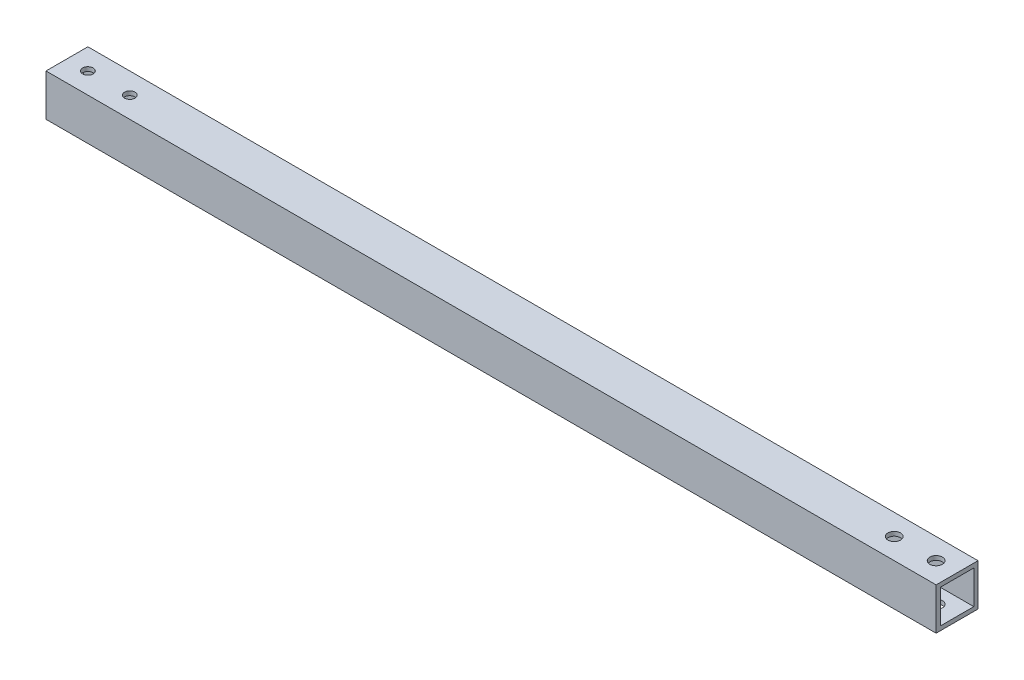
ISO-10303-21;
HEADER;
FILE_DESCRIPTION(('STEP AP214'),'2;1');
FILE_NAME('part.step','',(''),(''),'','','');
FILE_SCHEMA(('AUTOMOTIVE_DESIGN { 1 0 10303 214 1 1 1 1 }'));
ENDSEC;
DATA;
#1=APPLICATION_CONTEXT('core data for automotive mechanical design processes');
#2=APPLICATION_PROTOCOL_DEFINITION('international standard','automotive_design',2000,#1);
#3=PRODUCT_CONTEXT('',#1,'mechanical');
#4=PRODUCT('Part','Part','',(#3));
#5=PRODUCT_RELATED_PRODUCT_CATEGORY('part','',(#4));
#6=PRODUCT_DEFINITION_FORMATION('','',#4);
#7=PRODUCT_DEFINITION_CONTEXT('part definition',#1,'design');
#8=PRODUCT_DEFINITION('design','',#6,#7);
#9=PRODUCT_DEFINITION_SHAPE('','',#8);
#10=(LENGTH_UNIT() NAMED_UNIT(*) SI_UNIT(.MILLI.,.METRE.));
#11=(NAMED_UNIT(*) PLANE_ANGLE_UNIT() SI_UNIT($,.RADIAN.));
#12=(NAMED_UNIT(*) SI_UNIT($,.STERADIAN.) SOLID_ANGLE_UNIT());
#13=UNCERTAINTY_MEASURE_WITH_UNIT(LENGTH_MEASURE(1.E-05),#10,'distance_accuracy_value','');
#14=(GEOMETRIC_REPRESENTATION_CONTEXT(3) GLOBAL_UNCERTAINTY_ASSIGNED_CONTEXT((#13)) GLOBAL_UNIT_ASSIGNED_CONTEXT((#10,
#11,#12)) REPRESENTATION_CONTEXT('',''));
#15=CARTESIAN_POINT('',(0.,0.,0.));
#16=DIRECTION('',(0.,0.,1.));
#17=DIRECTION('',(1.,0.,0.));
#18=AXIS2_PLACEMENT_3D('',#15,#16,#17);
#19=CARTESIAN_POINT('',(212.5,0.,0.));
#20=DIRECTION('',(1.,0.,0.));
#21=DIRECTION('',(0.,0.,-1.));
#22=AXIS2_PLACEMENT_3D('',#19,#20,#21);
#23=PLANE('',#22);
#24=DIRECTION('',(0.,-1.,0.));
#25=VECTOR('',#24,1.);
#26=CARTESIAN_POINT('',(212.5,10.,10.));
#27=LINE('',#26,#25);
#28=CARTESIAN_POINT('',(212.5,10.,10.));
#29=VERTEX_POINT('',#28);
#30=CARTESIAN_POINT('',(212.5,-10.,10.));
#31=VERTEX_POINT('',#30);
#32=EDGE_CURVE('E138',#29,#31,#27,.T.);
#33=ORIENTED_EDGE('',*,*,#32,.T.);
#34=DIRECTION('',(0.,0.,-1.));
#35=VECTOR('',#34,1.);
#36=CARTESIAN_POINT('',(212.5,-10.,10.));
#37=LINE('',#36,#35);
#38=CARTESIAN_POINT('',(212.5,-10.,-10.));
#39=VERTEX_POINT('',#38);
#40=EDGE_CURVE('E141',#31,#39,#37,.T.);
#41=ORIENTED_EDGE('',*,*,#40,.T.);
#42=DIRECTION('',(0.,1.,0.));
#43=VECTOR('',#42,1.);
#44=CARTESIAN_POINT('',(212.5,10.,-10.));
#45=LINE('',#44,#43);
#46=CARTESIAN_POINT('',(212.5,10.,-10.));
#47=VERTEX_POINT('',#46);
#48=EDGE_CURVE('E144',#39,#47,#45,.T.);
#49=ORIENTED_EDGE('',*,*,#48,.T.);
#50=DIRECTION('',(0.,0.,1.));
#51=VECTOR('',#50,1.);
#52=CARTESIAN_POINT('',(212.5,10.,10.));
#53=LINE('',#52,#51);
#54=EDGE_CURVE('E146',#47,#29,#53,.T.);
#55=ORIENTED_EDGE('',*,*,#54,.T.);
#56=EDGE_LOOP('',(#33,#41,#49,#55));
#57=FACE_BOUND('',#56,.T.);
#58=DIRECTION('',(0.,1.,0.));
#59=VECTOR('',#58,1.);
#60=CARTESIAN_POINT('',(212.5,8.,-8.));
#61=LINE('',#60,#59);
#62=CARTESIAN_POINT('',(212.5,-8.,-8.));
#63=VERTEX_POINT('',#62);
#64=CARTESIAN_POINT('',(212.5,8.,-8.));
#65=VERTEX_POINT('',#64);
#66=EDGE_CURVE('E108',#63,#65,#61,.T.);
#67=ORIENTED_EDGE('',*,*,#66,.F.);
#68=DIRECTION('',(0.,0.,-1.));
#69=VECTOR('',#68,1.);
#70=CARTESIAN_POINT('',(212.5,-8.,-8.));
#71=LINE('',#70,#69);
#72=CARTESIAN_POINT('',(212.5,-8.,8.));
#73=VERTEX_POINT('',#72);
#74=EDGE_CURVE('E100',#73,#63,#71,.T.);
#75=ORIENTED_EDGE('',*,*,#74,.F.);
#76=DIRECTION('',(0.,-1.,0.));
#77=VECTOR('',#76,1.);
#78=CARTESIAN_POINT('',(212.5,8.,8.));
#79=LINE('',#78,#77);
#80=CARTESIAN_POINT('',(212.5,8.,8.));
#81=VERTEX_POINT('',#80);
#82=EDGE_CURVE('E122',#81,#73,#79,.T.);
#83=ORIENTED_EDGE('',*,*,#82,.F.);
#84=DIRECTION('',(0.,0.,1.));
#85=VECTOR('',#84,1.);
#86=CARTESIAN_POINT('',(212.5,8.,-8.));
#87=LINE('',#86,#85);
#88=EDGE_CURVE('E120',#65,#81,#87,.T.);
#89=ORIENTED_EDGE('',*,*,#88,.F.);
#90=EDGE_LOOP('',(#67,#75,#83,#89));
#91=FACE_BOUND('',#90,.T.);
#92=ADVANCED_FACE('F33',(#57,#91),#23,.T.);
#93=CARTESIAN_POINT('',(-212.5,0.,0.));
#94=DIRECTION('',(1.,0.,0.));
#95=DIRECTION('',(0.,0.,-1.));
#96=AXIS2_PLACEMENT_3D('',#93,#94,#95);
#97=PLANE('',#96);
#98=DIRECTION('',(0.,-1.,0.));
#99=VECTOR('',#98,1.);
#100=CARTESIAN_POINT('',(-212.5,10.,10.));
#101=LINE('',#100,#99);
#102=CARTESIAN_POINT('',(-212.5,10.,10.));
#103=VERTEX_POINT('',#102);
#104=CARTESIAN_POINT('',(-212.5,-10.,10.));
#105=VERTEX_POINT('',#104);
#106=EDGE_CURVE('E116',#103,#105,#101,.T.);
#107=ORIENTED_EDGE('',*,*,#106,.F.);
#108=DIRECTION('',(0.,0.,1.));
#109=VECTOR('',#108,1.);
#110=CARTESIAN_POINT('',(-212.5,10.,10.));
#111=LINE('',#110,#109);
#112=CARTESIAN_POINT('',(-212.5,10.,-10.));
#113=VERTEX_POINT('',#112);
#114=EDGE_CURVE('E142',#113,#103,#111,.T.);
#115=ORIENTED_EDGE('',*,*,#114,.F.);
#116=DIRECTION('',(0.,1.,0.));
#117=VECTOR('',#116,1.);
#118=CARTESIAN_POINT('',(-212.5,10.,-10.));
#119=LINE('',#118,#117);
#120=CARTESIAN_POINT('',(-212.5,-10.,-10.));
#121=VERTEX_POINT('',#120);
#122=EDGE_CURVE('E153',#121,#113,#119,.T.);
#123=ORIENTED_EDGE('',*,*,#122,.F.);
#124=DIRECTION('',(0.,0.,-1.));
#125=VECTOR('',#124,1.);
#126=CARTESIAN_POINT('',(-212.5,-10.,10.));
#127=LINE('',#126,#125);
#128=EDGE_CURVE('E151',#105,#121,#127,.T.);
#129=ORIENTED_EDGE('',*,*,#128,.F.);
#130=EDGE_LOOP('',(#107,#115,#123,#129));
#131=FACE_BOUND('',#130,.T.);
#132=DIRECTION('',(0.,0.,-1.));
#133=VECTOR('',#132,1.);
#134=CARTESIAN_POINT('',(-212.5,-8.,-8.));
#135=LINE('',#134,#133);
#136=CARTESIAN_POINT('',(-212.5,-8.,8.));
#137=VERTEX_POINT('',#136);
#138=CARTESIAN_POINT('',(-212.5,-8.,-8.));
#139=VERTEX_POINT('',#138);
#140=EDGE_CURVE('E58',#137,#139,#135,.T.);
#141=ORIENTED_EDGE('',*,*,#140,.T.);
#142=DIRECTION('',(0.,1.,0.));
#143=VECTOR('',#142,1.);
#144=CARTESIAN_POINT('',(-212.5,8.,-8.));
#145=LINE('',#144,#143);
#146=CARTESIAN_POINT('',(-212.5,8.,-8.));
#147=VERTEX_POINT('',#146);
#148=EDGE_CURVE('E115',#139,#147,#145,.T.);
#149=ORIENTED_EDGE('',*,*,#148,.T.);
#150=DIRECTION('',(0.,0.,1.));
#151=VECTOR('',#150,1.);
#152=CARTESIAN_POINT('',(-212.5,8.,-8.));
#153=LINE('',#152,#151);
#154=CARTESIAN_POINT('',(-212.5,8.,8.));
#155=VERTEX_POINT('',#154);
#156=EDGE_CURVE('E130',#147,#155,#153,.T.);
#157=ORIENTED_EDGE('',*,*,#156,.T.);
#158=DIRECTION('',(0.,-1.,0.));
#159=VECTOR('',#158,1.);
#160=CARTESIAN_POINT('',(-212.5,8.,8.));
#161=LINE('',#160,#159);
#162=EDGE_CURVE('E109',#155,#137,#161,.T.);
#163=ORIENTED_EDGE('',*,*,#162,.T.);
#164=EDGE_LOOP('',(#141,#149,#157,#163));
#165=FACE_BOUND('',#164,.T.);
#166=ADVANCED_FACE('F224',(#131,#165),#97,.F.);
#167=CARTESIAN_POINT('',(212.5,10.,10.));
#168=DIRECTION('',(0.,0.,-1.));
#169=DIRECTION('',(-1.,0.,0.));
#170=AXIS2_PLACEMENT_3D('',#167,#168,#169);
#171=PLANE('',#170);
#172=ORIENTED_EDGE('',*,*,#106,.T.);
#173=DIRECTION('',(-1.,0.,0.));
#174=VECTOR('',#173,1.);
#175=CARTESIAN_POINT('',(212.5,-10.,10.));
#176=LINE('',#175,#174);
#177=EDGE_CURVE('E11',#31,#105,#176,.T.);
#178=ORIENTED_EDGE('',*,*,#177,.F.);
#179=ORIENTED_EDGE('',*,*,#32,.F.);
#180=DIRECTION('',(-1.,0.,0.));
#181=VECTOR('',#180,1.);
#182=CARTESIAN_POINT('',(212.5,10.,10.));
#183=LINE('',#182,#181);
#184=EDGE_CURVE('E148',#29,#103,#183,.T.);
#185=ORIENTED_EDGE('',*,*,#184,.T.);
#186=EDGE_LOOP('',(#172,#178,#179,#185));
#187=FACE_BOUND('',#186,.T.);
#188=ADVANCED_FACE('F35',(#187),#171,.F.);
#189=CARTESIAN_POINT('',(212.5,-10.,10.));
#190=DIRECTION('',(0.,1.,0.));
#191=DIRECTION('',(0.,0.,1.));
#192=AXIS2_PLACEMENT_3D('',#189,#190,#191);
#193=PLANE('',#192);
#194=CARTESIAN_POINT('',(-182.5,-10.,0.));
#195=DIRECTION('',(0.,1.,0.));
#196=DIRECTION('',(0.,0.,1.));
#197=AXIS2_PLACEMENT_3D('',#194,#195,#196);
#198=CIRCLE('',#197,2.5);
#199=CARTESIAN_POINT('',(-182.5,-10.,2.50000000000002));
#200=VERTEX_POINT('',#199);
#201=EDGE_CURVE('E243',#200,#200,#198,.T.);
#202=ORIENTED_EDGE('',*,*,#201,.T.);
#203=EDGE_LOOP('',(#202));
#204=FACE_BOUND('',#203,.T.);
#205=CARTESIAN_POINT('',(-202.5,-10.,0.));
#206=DIRECTION('',(0.,1.,0.));
#207=DIRECTION('',(0.,0.,1.));
#208=AXIS2_PLACEMENT_3D('',#205,#206,#207);
#209=CIRCLE('',#208,2.5);
#210=CARTESIAN_POINT('',(-202.5,-10.,2.50000000000002));
#211=VERTEX_POINT('',#210);
#212=EDGE_CURVE('E174',#211,#211,#209,.T.);
#213=ORIENTED_EDGE('',*,*,#212,.T.);
#214=EDGE_LOOP('',(#213));
#215=FACE_BOUND('',#214,.T.);
#216=CARTESIAN_POINT('',(202.5,-10.,0.));
#217=DIRECTION('',(0.,1.,0.));
#218=DIRECTION('',(0.,0.,1.));
#219=AXIS2_PLACEMENT_3D('',#216,#217,#218);
#220=CIRCLE('',#219,2.99999999999999);
#221=CARTESIAN_POINT('',(202.5,-10.,2.99999999999999));
#222=VERTEX_POINT('',#221);
#223=EDGE_CURVE('E170',#222,#222,#220,.T.);
#224=ORIENTED_EDGE('',*,*,#223,.T.);
#225=EDGE_LOOP('',(#224));
#226=FACE_BOUND('',#225,.T.);
#227=CARTESIAN_POINT('',(182.5,-10.,0.));
#228=DIRECTION('',(0.,1.,0.));
#229=DIRECTION('',(0.,0.,1.));
#230=AXIS2_PLACEMENT_3D('',#227,#228,#229);
#231=CIRCLE('',#230,2.99999999999999);
#232=CARTESIAN_POINT('',(182.5,-10.,2.99999999999999));
#233=VERTEX_POINT('',#232);
#234=EDGE_CURVE('E166',#233,#233,#231,.T.);
#235=ORIENTED_EDGE('',*,*,#234,.T.);
#236=EDGE_LOOP('',(#235));
#237=FACE_BOUND('',#236,.T.);
#238=ORIENTED_EDGE('',*,*,#128,.T.);
#239=DIRECTION('',(-1.,0.,0.));
#240=VECTOR('',#239,1.);
#241=CARTESIAN_POINT('',(212.5,-10.,-10.));
#242=LINE('',#241,#240);
#243=EDGE_CURVE('E42',#39,#121,#242,.T.);
#244=ORIENTED_EDGE('',*,*,#243,.F.);
#245=ORIENTED_EDGE('',*,*,#40,.F.);
#246=ORIENTED_EDGE('',*,*,#177,.T.);
#247=EDGE_LOOP('',(#238,#244,#245,#246));
#248=FACE_BOUND('',#247,.T.);
#249=ADVANCED_FACE('F233',(#204,#215,#226,#237,#248),#193,.F.);
#250=CARTESIAN_POINT('',(212.5,10.,-10.));
#251=DIRECTION('',(0.,0.,1.));
#252=DIRECTION('',(1.,0.,0.));
#253=AXIS2_PLACEMENT_3D('',#250,#251,#252);
#254=PLANE('',#253);
#255=ORIENTED_EDGE('',*,*,#122,.T.);
#256=DIRECTION('',(-1.,0.,0.));
#257=VECTOR('',#256,1.);
#258=CARTESIAN_POINT('',(212.5,10.,-10.));
#259=LINE('',#258,#257);
#260=EDGE_CURVE('E158',#47,#113,#259,.T.);
#261=ORIENTED_EDGE('',*,*,#260,.F.);
#262=ORIENTED_EDGE('',*,*,#48,.F.);
#263=ORIENTED_EDGE('',*,*,#243,.T.);
#264=EDGE_LOOP('',(#255,#261,#262,#263));
#265=FACE_BOUND('',#264,.T.);
#266=ADVANCED_FACE('F217',(#265),#254,.F.);
#267=CARTESIAN_POINT('',(212.5,10.,10.));
#268=DIRECTION('',(0.,-1.,0.));
#269=DIRECTION('',(0.,0.,-1.));
#270=AXIS2_PLACEMENT_3D('',#267,#268,#269);
#271=PLANE('',#270);
#272=CARTESIAN_POINT('',(-182.5,10.,0.));
#273=DIRECTION('',(0.,1.,0.));
#274=DIRECTION('',(0.,0.,1.));
#275=AXIS2_PLACEMENT_3D('',#272,#273,#274);
#276=CIRCLE('',#275,2.5);
#277=CARTESIAN_POINT('',(-182.5,10.,2.50000000000002));
#278=VERTEX_POINT('',#277);
#279=EDGE_CURVE('E299',#278,#278,#276,.T.);
#280=ORIENTED_EDGE('',*,*,#279,.F.);
#281=EDGE_LOOP('',(#280));
#282=FACE_BOUND('',#281,.T.);
#283=CARTESIAN_POINT('',(-202.5,10.,0.));
#284=DIRECTION('',(0.,1.,0.));
#285=DIRECTION('',(0.,0.,1.));
#286=AXIS2_PLACEMENT_3D('',#283,#284,#285);
#287=CIRCLE('',#286,2.5);
#288=CARTESIAN_POINT('',(-202.5,10.,2.50000000000002));
#289=VERTEX_POINT('',#288);
#290=EDGE_CURVE('E181',#289,#289,#287,.T.);
#291=ORIENTED_EDGE('',*,*,#290,.F.);
#292=EDGE_LOOP('',(#291));
#293=FACE_BOUND('',#292,.T.);
#294=CARTESIAN_POINT('',(202.5,10.,0.));
#295=DIRECTION('',(0.,1.,0.));
#296=DIRECTION('',(0.,0.,1.));
#297=AXIS2_PLACEMENT_3D('',#294,#295,#296);
#298=CIRCLE('',#297,2.99999999999999);
#299=CARTESIAN_POINT('',(202.5,10.,2.99999999999999));
#300=VERTEX_POINT('',#299);
#301=EDGE_CURVE('E178',#300,#300,#298,.T.);
#302=ORIENTED_EDGE('',*,*,#301,.F.);
#303=EDGE_LOOP('',(#302));
#304=FACE_BOUND('',#303,.T.);
#305=CARTESIAN_POINT('',(182.5,10.,0.));
#306=DIRECTION('',(0.,1.,0.));
#307=DIRECTION('',(0.,0.,1.));
#308=AXIS2_PLACEMENT_3D('',#305,#306,#307);
#309=CIRCLE('',#308,2.99999999999999);
#310=CARTESIAN_POINT('',(182.5,10.,2.99999999999999));
#311=VERTEX_POINT('',#310);
#312=EDGE_CURVE('E197',#311,#311,#309,.T.);
#313=ORIENTED_EDGE('',*,*,#312,.F.);
#314=EDGE_LOOP('',(#313));
#315=FACE_BOUND('',#314,.T.);
#316=ORIENTED_EDGE('',*,*,#114,.T.);
#317=ORIENTED_EDGE('',*,*,#184,.F.);
#318=ORIENTED_EDGE('',*,*,#54,.F.);
#319=ORIENTED_EDGE('',*,*,#260,.T.);
#320=EDGE_LOOP('',(#316,#317,#318,#319));
#321=FACE_BOUND('',#320,.T.);
#322=ADVANCED_FACE('F208',(#282,#293,#304,#315,#321),#271,.F.);
#323=CARTESIAN_POINT('',(212.5,-8.,-8.));
#324=DIRECTION('',(0.,1.,0.));
#325=DIRECTION('',(0.,0.,1.));
#326=AXIS2_PLACEMENT_3D('',#323,#324,#325);
#327=PLANE('',#326);
#328=CARTESIAN_POINT('',(-182.5,-8.,0.));
#329=DIRECTION('',(0.,1.,0.));
#330=DIRECTION('',(0.,0.,1.));
#331=AXIS2_PLACEMENT_3D('',#328,#329,#330);
#332=CIRCLE('',#331,2.5);
#333=CARTESIAN_POINT('',(-182.5,-8.,2.50000000000002));
#334=VERTEX_POINT('',#333);
#335=EDGE_CURVE('E186',#334,#334,#332,.T.);
#336=ORIENTED_EDGE('',*,*,#335,.F.);
#337=EDGE_LOOP('',(#336));
#338=FACE_BOUND('',#337,.T.);
#339=CARTESIAN_POINT('',(-202.5,-8.,0.));
#340=DIRECTION('',(0.,1.,0.));
#341=DIRECTION('',(0.,0.,1.));
#342=AXIS2_PLACEMENT_3D('',#339,#340,#341);
#343=CIRCLE('',#342,2.5);
#344=CARTESIAN_POINT('',(-202.5,-8.,2.50000000000002));
#345=VERTEX_POINT('',#344);
#346=EDGE_CURVE('E173',#345,#345,#343,.T.);
#347=ORIENTED_EDGE('',*,*,#346,.F.);
#348=EDGE_LOOP('',(#347));
#349=FACE_BOUND('',#348,.T.);
#350=CARTESIAN_POINT('',(202.5,-8.,0.));
#351=DIRECTION('',(0.,1.,0.));
#352=DIRECTION('',(0.,0.,1.));
#353=AXIS2_PLACEMENT_3D('',#350,#351,#352);
#354=CIRCLE('',#353,2.99999999999999);
#355=CARTESIAN_POINT('',(202.5,-8.,2.99999999999999));
#356=VERTEX_POINT('',#355);
#357=EDGE_CURVE('E169',#356,#356,#354,.T.);
#358=ORIENTED_EDGE('',*,*,#357,.F.);
#359=EDGE_LOOP('',(#358));
#360=FACE_BOUND('',#359,.T.);
#361=CARTESIAN_POINT('',(182.5,-8.,0.));
#362=DIRECTION('',(0.,1.,0.));
#363=DIRECTION('',(0.,0.,1.));
#364=AXIS2_PLACEMENT_3D('',#361,#362,#363);
#365=CIRCLE('',#364,2.99999999999999);
#366=CARTESIAN_POINT('',(182.5,-8.,2.99999999999999));
#367=VERTEX_POINT('',#366);
#368=EDGE_CURVE('E128',#367,#367,#365,.T.);
#369=ORIENTED_EDGE('',*,*,#368,.F.);
#370=EDGE_LOOP('',(#369));
#371=FACE_BOUND('',#370,.T.);
#372=ORIENTED_EDGE('',*,*,#140,.F.);
#373=DIRECTION('',(-1.,0.,0.));
#374=VECTOR('',#373,1.);
#375=CARTESIAN_POINT('',(212.5,-8.,8.));
#376=LINE('',#375,#374);
#377=EDGE_CURVE('E104',#73,#137,#376,.T.);
#378=ORIENTED_EDGE('',*,*,#377,.F.);
#379=ORIENTED_EDGE('',*,*,#74,.T.);
#380=DIRECTION('',(-1.,0.,0.));
#381=VECTOR('',#380,1.);
#382=CARTESIAN_POINT('',(212.5,-8.,-8.));
#383=LINE('',#382,#381);
#384=EDGE_CURVE('E103',#63,#139,#383,.T.);
#385=ORIENTED_EDGE('',*,*,#384,.T.);
#386=EDGE_LOOP('',(#372,#378,#379,#385));
#387=FACE_BOUND('',#386,.T.);
#388=ADVANCED_FACE('F102',(#338,#349,#360,#371,#387),#327,.T.);
#389=CARTESIAN_POINT('',(212.5,8.,-8.));
#390=DIRECTION('',(0.,0.,1.));
#391=DIRECTION('',(1.,0.,0.));
#392=AXIS2_PLACEMENT_3D('',#389,#390,#391);
#393=PLANE('',#392);
#394=ORIENTED_EDGE('',*,*,#148,.F.);
#395=ORIENTED_EDGE('',*,*,#384,.F.);
#396=ORIENTED_EDGE('',*,*,#66,.T.);
#397=DIRECTION('',(-1.,0.,0.));
#398=VECTOR('',#397,1.);
#399=CARTESIAN_POINT('',(212.5,8.,-8.));
#400=LINE('',#399,#398);
#401=EDGE_CURVE('E117',#65,#147,#400,.T.);
#402=ORIENTED_EDGE('',*,*,#401,.T.);
#403=EDGE_LOOP('',(#394,#395,#396,#402));
#404=FACE_BOUND('',#403,.T.);
#405=ADVANCED_FACE('F112',(#404),#393,.T.);
#406=CARTESIAN_POINT('',(212.5,8.,-8.));
#407=DIRECTION('',(0.,-1.,0.));
#408=DIRECTION('',(0.,0.,-1.));
#409=AXIS2_PLACEMENT_3D('',#406,#407,#408);
#410=PLANE('',#409);
#411=CARTESIAN_POINT('',(-182.5,8.,0.));
#412=DIRECTION('',(0.,-1.,0.));
#413=DIRECTION('',(0.,0.,-1.));
#414=AXIS2_PLACEMENT_3D('',#411,#412,#413);
#415=CIRCLE('',#414,2.5);
#416=CARTESIAN_POINT('',(-182.5,8.,-2.49999999999997));
#417=VERTEX_POINT('',#416);
#418=EDGE_CURVE('E37',#417,#417,#415,.T.);
#419=ORIENTED_EDGE('',*,*,#418,.F.);
#420=EDGE_LOOP('',(#419));
#421=FACE_BOUND('',#420,.T.);
#422=CARTESIAN_POINT('',(-202.5,8.,0.));
#423=DIRECTION('',(0.,-1.,0.));
#424=DIRECTION('',(0.,0.,-1.));
#425=AXIS2_PLACEMENT_3D('',#422,#423,#424);
#426=CIRCLE('',#425,2.5);
#427=CARTESIAN_POINT('',(-202.5,8.,-2.49999999999997));
#428=VERTEX_POINT('',#427);
#429=EDGE_CURVE('E171',#428,#428,#426,.T.);
#430=ORIENTED_EDGE('',*,*,#429,.F.);
#431=EDGE_LOOP('',(#430));
#432=FACE_BOUND('',#431,.T.);
#433=CARTESIAN_POINT('',(202.5,8.,0.));
#434=DIRECTION('',(0.,-1.,0.));
#435=DIRECTION('',(0.,0.,-1.));
#436=AXIS2_PLACEMENT_3D('',#433,#434,#435);
#437=CIRCLE('',#436,2.99999999999999);
#438=CARTESIAN_POINT('',(202.5,8.,-2.99999999999999));
#439=VERTEX_POINT('',#438);
#440=EDGE_CURVE('E167',#439,#439,#437,.T.);
#441=ORIENTED_EDGE('',*,*,#440,.F.);
#442=EDGE_LOOP('',(#441));
#443=FACE_BOUND('',#442,.T.);
#444=CARTESIAN_POINT('',(182.5,8.,0.));
#445=DIRECTION('',(0.,-1.,0.));
#446=DIRECTION('',(0.,0.,-1.));
#447=AXIS2_PLACEMENT_3D('',#444,#445,#446);
#448=CIRCLE('',#447,2.99999999999999);
#449=CARTESIAN_POINT('',(182.5,8.,-2.99999999999999));
#450=VERTEX_POINT('',#449);
#451=EDGE_CURVE('E163',#450,#450,#448,.T.);
#452=ORIENTED_EDGE('',*,*,#451,.F.);
#453=EDGE_LOOP('',(#452));
#454=FACE_BOUND('',#453,.T.);
#455=ORIENTED_EDGE('',*,*,#156,.F.);
#456=ORIENTED_EDGE('',*,*,#401,.F.);
#457=ORIENTED_EDGE('',*,*,#88,.T.);
#458=DIRECTION('',(-1.,0.,0.));
#459=VECTOR('',#458,1.);
#460=CARTESIAN_POINT('',(212.5,8.,8.));
#461=LINE('',#460,#459);
#462=EDGE_CURVE('E50',#81,#155,#461,.T.);
#463=ORIENTED_EDGE('',*,*,#462,.T.);
#464=EDGE_LOOP('',(#455,#456,#457,#463));
#465=FACE_BOUND('',#464,.T.);
#466=ADVANCED_FACE('F215',(#421,#432,#443,#454,#465),#410,.T.);
#467=CARTESIAN_POINT('',(212.5,8.,8.));
#468=DIRECTION('',(0.,0.,-1.));
#469=DIRECTION('',(-1.,0.,0.));
#470=AXIS2_PLACEMENT_3D('',#467,#468,#469);
#471=PLANE('',#470);
#472=ORIENTED_EDGE('',*,*,#162,.F.);
#473=ORIENTED_EDGE('',*,*,#462,.F.);
#474=ORIENTED_EDGE('',*,*,#82,.T.);
#475=ORIENTED_EDGE('',*,*,#377,.T.);
#476=EDGE_LOOP('',(#472,#473,#474,#475));
#477=FACE_BOUND('',#476,.T.);
#478=ADVANCED_FACE('F262',(#477),#471,.T.);
#479=CARTESIAN_POINT('',(182.5,-10.,0.));
#480=DIRECTION('',(0.,1.,0.));
#481=DIRECTION('',(0.,0.,1.));
#482=AXIS2_PLACEMENT_3D('',#479,#480,#481);
#483=CYLINDRICAL_SURFACE('',#482,2.99999999999999);
#484=ORIENTED_EDGE('',*,*,#451,.T.);
#485=EDGE_LOOP('',(#484));
#486=FACE_BOUND('',#485,.T.);
#487=ORIENTED_EDGE('',*,*,#312,.T.);
#488=EDGE_LOOP('',(#487));
#489=FACE_BOUND('',#488,.T.);
#490=ADVANCED_FACE('F264',(#486,#489),#483,.F.);
#491=ORIENTED_EDGE('',*,*,#368,.T.);
#492=EDGE_LOOP('',(#491));
#493=FACE_BOUND('',#492,.T.);
#494=ORIENTED_EDGE('',*,*,#234,.F.);
#495=EDGE_LOOP('',(#494));
#496=FACE_BOUND('',#495,.T.);
#497=ADVANCED_FACE('F204',(#493,#496),#483,.F.);
#498=CARTESIAN_POINT('',(202.5,-10.,0.));
#499=DIRECTION('',(0.,1.,0.));
#500=DIRECTION('',(0.,0.,1.));
#501=AXIS2_PLACEMENT_3D('',#498,#499,#500);
#502=CYLINDRICAL_SURFACE('',#501,2.99999999999999);
#503=ORIENTED_EDGE('',*,*,#440,.T.);
#504=EDGE_LOOP('',(#503));
#505=FACE_BOUND('',#504,.T.);
#506=ORIENTED_EDGE('',*,*,#301,.T.);
#507=EDGE_LOOP('',(#506));
#508=FACE_BOUND('',#507,.T.);
#509=ADVANCED_FACE('F275',(#505,#508),#502,.F.);
#510=ORIENTED_EDGE('',*,*,#357,.T.);
#511=EDGE_LOOP('',(#510));
#512=FACE_BOUND('',#511,.T.);
#513=ORIENTED_EDGE('',*,*,#223,.F.);
#514=EDGE_LOOP('',(#513));
#515=FACE_BOUND('',#514,.T.);
#516=ADVANCED_FACE('F278',(#512,#515),#502,.F.);
#517=CARTESIAN_POINT('',(-202.5,-10.,0.));
#518=DIRECTION('',(0.,1.,0.));
#519=DIRECTION('',(0.,0.,1.));
#520=AXIS2_PLACEMENT_3D('',#517,#518,#519);
#521=CYLINDRICAL_SURFACE('',#520,2.5);
#522=ORIENTED_EDGE('',*,*,#429,.T.);
#523=EDGE_LOOP('',(#522));
#524=FACE_BOUND('',#523,.T.);
#525=ORIENTED_EDGE('',*,*,#290,.T.);
#526=EDGE_LOOP('',(#525));
#527=FACE_BOUND('',#526,.T.);
#528=ADVANCED_FACE('F280',(#524,#527),#521,.F.);
#529=ORIENTED_EDGE('',*,*,#346,.T.);
#530=EDGE_LOOP('',(#529));
#531=FACE_BOUND('',#530,.T.);
#532=ORIENTED_EDGE('',*,*,#212,.F.);
#533=EDGE_LOOP('',(#532));
#534=FACE_BOUND('',#533,.T.);
#535=ADVANCED_FACE('F283',(#531,#534),#521,.F.);
#536=CARTESIAN_POINT('',(-182.5,-10.,0.));
#537=DIRECTION('',(0.,1.,0.));
#538=DIRECTION('',(0.,0.,1.));
#539=AXIS2_PLACEMENT_3D('',#536,#537,#538);
#540=CYLINDRICAL_SURFACE('',#539,2.5);
#541=ORIENTED_EDGE('',*,*,#418,.T.);
#542=EDGE_LOOP('',(#541));
#543=FACE_BOUND('',#542,.T.);
#544=ORIENTED_EDGE('',*,*,#279,.T.);
#545=EDGE_LOOP('',(#544));
#546=FACE_BOUND('',#545,.T.);
#547=ADVANCED_FACE('F284',(#543,#546),#540,.F.);
#548=ORIENTED_EDGE('',*,*,#335,.T.);
#549=EDGE_LOOP('',(#548));
#550=FACE_BOUND('',#549,.T.);
#551=ORIENTED_EDGE('',*,*,#201,.F.);
#552=EDGE_LOOP('',(#551));
#553=FACE_BOUND('',#552,.T.);
#554=ADVANCED_FACE('F286',(#550,#553),#540,.F.);
#555=CLOSED_SHELL('',(#92,#166,#188,#249,#266,#322,#388,#405,#466,#478,#490,#497,#509,#516,#528,
#535,#547,#554));
#556=MANIFOLD_SOLID_BREP('B2',#555);
#557=ADVANCED_BREP_SHAPE_REPRESENTATION('',(#18,#556),#14);
#558=SHAPE_DEFINITION_REPRESENTATION(#9,#557);
ENDSEC;
END-ISO-10303-21;
